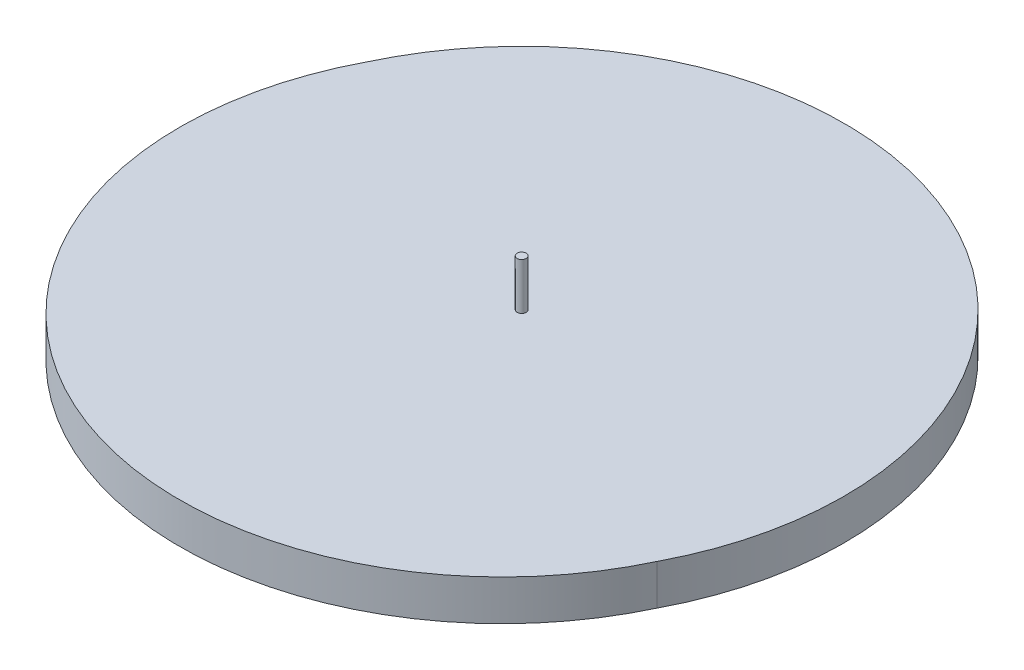
ISO-10303-21;
HEADER;
FILE_DESCRIPTION(('STEP AP214'),'2;1');
FILE_NAME('part.step','',(''),(''),'','','');
FILE_SCHEMA(('AUTOMOTIVE_DESIGN { 1 0 10303 214 1 1 1 1 }'));
ENDSEC;
DATA;
#1=APPLICATION_CONTEXT('core data for automotive mechanical design processes');
#2=APPLICATION_PROTOCOL_DEFINITION('international standard','automotive_design',2000,#1);
#3=PRODUCT_CONTEXT('',#1,'mechanical');
#4=PRODUCT('Part','Part','',(#3));
#5=PRODUCT_RELATED_PRODUCT_CATEGORY('part','',(#4));
#6=PRODUCT_DEFINITION_FORMATION('','',#4);
#7=PRODUCT_DEFINITION_CONTEXT('part definition',#1,'design');
#8=PRODUCT_DEFINITION('design','',#6,#7);
#9=PRODUCT_DEFINITION_SHAPE('','',#8);
#10=(LENGTH_UNIT() NAMED_UNIT(*) SI_UNIT(.MILLI.,.METRE.));
#11=(NAMED_UNIT(*) PLANE_ANGLE_UNIT() SI_UNIT($,.RADIAN.));
#12=(NAMED_UNIT(*) SI_UNIT($,.STERADIAN.) SOLID_ANGLE_UNIT());
#13=UNCERTAINTY_MEASURE_WITH_UNIT(LENGTH_MEASURE(1.E-05),#10,'distance_accuracy_value','');
#14=(GEOMETRIC_REPRESENTATION_CONTEXT(3) GLOBAL_UNCERTAINTY_ASSIGNED_CONTEXT((#13)) GLOBAL_UNIT_ASSIGNED_CONTEXT((#10,
#11,#12)) REPRESENTATION_CONTEXT('',''));
#15=CARTESIAN_POINT('',(0.,0.,0.));
#16=DIRECTION('',(0.,0.,1.));
#17=DIRECTION('',(1.,0.,0.));
#18=AXIS2_PLACEMENT_3D('',#15,#16,#17);
#19=CARTESIAN_POINT('',(951.903947575167,1.56125112837913E-12,9.96365764271792));
#20=DIRECTION('',(0.,-1.,0.));
#21=DIRECTION('',(0.,0.,-1.));
#22=AXIS2_PLACEMENT_3D('',#19,#20,#21);
#23=CYLINDRICAL_SURFACE('',#22,334.999999999987);
#24=CARTESIAN_POINT('',(951.903947575167,-20.9999999999984,9.96365764271792));
#25=DIRECTION('',(0.,-1.,0.));
#26=DIRECTION('',(0.,0.,-1.));
#27=AXIS2_PLACEMENT_3D('',#24,#25,#26);
#28=CIRCLE('',#27,334.999999999987);
#29=CARTESIAN_POINT('',(1248.44777688776,-20.999999999999,165.805748544415));
#30=VERTEX_POINT('',#29);
#31=CARTESIAN_POINT('',(648.681133677734,-20.9999999999985,-132.447455449323));
#32=VERTEX_POINT('',#31);
#33=EDGE_CURVE('E73',#30,#32,#28,.F.);
#34=ORIENTED_EDGE('',*,*,#33,.T.);
#35=DIRECTION('',(0.,-1.,0.));
#36=VECTOR('',#35,1.);
#37=CARTESIAN_POINT('',(648.681133677734,1.52308721190764E-12,-132.447455449323));
#38=LINE('',#37,#36);
#39=CARTESIAN_POINT('',(648.681133677734,21.0000000000015,-132.447455449323));
#40=VERTEX_POINT('',#39);
#41=EDGE_CURVE('E88',#32,#40,#38,.F.);
#42=ORIENTED_EDGE('',*,*,#41,.T.);
#43=CARTESIAN_POINT('',(951.903947575167,21.0000000000016,9.96365764271792));
#44=DIRECTION('',(0.,-1.,0.));
#45=DIRECTION('',(0.,0.,-1.));
#46=AXIS2_PLACEMENT_3D('',#43,#44,#45);
#47=CIRCLE('',#46,334.999999999987);
#48=CARTESIAN_POINT('',(1248.44777688776,21.0000000000015,165.805748544415));
#49=VERTEX_POINT('',#48);
#50=EDGE_CURVE('E101',#40,#49,#47,.T.);
#51=ORIENTED_EDGE('',*,*,#50,.T.);
#52=DIRECTION('',(0.,-1.,0.));
#53=VECTOR('',#52,1.);
#54=CARTESIAN_POINT('',(1248.44777688776,1.52308721190764E-12,165.805748544415));
#55=LINE('',#54,#53);
#56=EDGE_CURVE('E97',#49,#30,#55,.T.);
#57=ORIENTED_EDGE('',*,*,#56,.T.);
#58=EDGE_LOOP('',(#34,#42,#51,#57));
#59=FACE_BOUND('',#58,.T.);
#60=ADVANCED_FACE('F61',(#59),#23,.T.);
#61=CARTESIAN_POINT('',(951.903947575167,-20.9999999999984,9.96365764271792));
#62=DIRECTION('',(0.,-1.,0.));
#63=DIRECTION('',(0.,0.,-1.));
#64=AXIS2_PLACEMENT_3D('',#61,#62,#63);
#65=PLANE('',#64);
#66=ORIENTED_EDGE('',*,*,#33,.F.);
#67=CARTESIAN_POINT('',(945.224962990449,-20.9999999999985,23.3946354521365));
#68=DIRECTION('',(0.,1.,0.));
#69=DIRECTION('',(0.,0.,1.));
#70=AXIS2_PLACEMENT_3D('',#67,#68,#69);
#71=CIRCLE('',#70,334.999999999981);
#72=EDGE_CURVE('E78',#32,#30,#71,.T.);
#73=ORIENTED_EDGE('',*,*,#72,.F.);
#74=EDGE_LOOP('',(#66,#73));
#75=FACE_BOUND('',#74,.T.);
#76=CARTESIAN_POINT('',(951.903947575167,-20.9999999999984,9.96365764271792));
#77=DIRECTION('',(0.,-1.,0.));
#78=DIRECTION('',(0.,0.,-1.));
#79=AXIS2_PLACEMENT_3D('',#76,#77,#78);
#80=CIRCLE('',#79,4.74999999998679);
#81=CARTESIAN_POINT('',(951.903947575167,-20.9999999999982,5.21365764273113));
#82=VERTEX_POINT('',#81);
#83=EDGE_CURVE('E104',#82,#82,#80,.F.);
#84=ORIENTED_EDGE('',*,*,#83,.T.);
#85=EDGE_LOOP('',(#84));
#86=FACE_BOUND('',#85,.T.);
#87=ADVANCED_FACE('F69',(#75,#86),#65,.T.);
#88=CARTESIAN_POINT('',(951.903947575167,21.0000000000016,9.96365764271792));
#89=DIRECTION('',(0.,-1.,0.));
#90=DIRECTION('',(0.,0.,-1.));
#91=AXIS2_PLACEMENT_3D('',#88,#89,#90);
#92=PLANE('',#91);
#93=ORIENTED_EDGE('',*,*,#50,.F.);
#94=CARTESIAN_POINT('',(945.224962990449,21.0000000000015,23.3946354521365));
#95=DIRECTION('',(0.,1.,0.));
#96=DIRECTION('',(0.,0.,1.));
#97=AXIS2_PLACEMENT_3D('',#94,#95,#96);
#98=CIRCLE('',#97,334.999999999981);
#99=EDGE_CURVE('E81',#40,#49,#98,.T.);
#100=ORIENTED_EDGE('',*,*,#99,.T.);
#101=EDGE_LOOP('',(#93,#100));
#102=FACE_BOUND('',#101,.T.);
#103=CARTESIAN_POINT('',(951.903947575167,21.0000000000016,9.96365764271792));
#104=DIRECTION('',(0.,-1.,0.));
#105=DIRECTION('',(0.,0.,-1.));
#106=AXIS2_PLACEMENT_3D('',#103,#104,#105);
#107=CIRCLE('',#106,4.74999999998679);
#108=CARTESIAN_POINT('',(951.903947575167,21.0000000000018,5.21365764273113));
#109=VERTEX_POINT('',#108);
#110=EDGE_CURVE('E12',#109,#109,#107,.F.);
#111=ORIENTED_EDGE('',*,*,#110,.F.);
#112=EDGE_LOOP('',(#111));
#113=FACE_BOUND('',#112,.T.);
#114=ADVANCED_FACE('F116',(#102,#113),#92,.F.);
#115=CARTESIAN_POINT('',(951.903947575167,69.5,9.96365764271792));
#116=DIRECTION('',(0.,1.,0.));
#117=DIRECTION('',(0.,0.,1.));
#118=AXIS2_PLACEMENT_3D('',#115,#116,#117);
#119=PLANE('',#118);
#120=CARTESIAN_POINT('',(951.903947575167,69.5,9.96365764271792));
#121=DIRECTION('',(0.,1.,0.));
#122=DIRECTION('',(0.,0.,1.));
#123=AXIS2_PLACEMENT_3D('',#120,#121,#122);
#124=CIRCLE('',#123,4.74999999998679);
#125=CARTESIAN_POINT('',(951.903947575167,69.5,14.7136576427047));
#126=VERTEX_POINT('',#125);
#127=EDGE_CURVE('E107',#126,#126,#124,.T.);
#128=ORIENTED_EDGE('',*,*,#127,.T.);
#129=EDGE_LOOP('',(#128));
#130=FACE_BOUND('',#129,.T.);
#131=ADVANCED_FACE('F118',(#130),#119,.T.);
#132=CARTESIAN_POINT('',(951.903947575167,69.5,9.96365764271792));
#133=DIRECTION('',(0.,-1.,0.));
#134=DIRECTION('',(0.,0.,-1.));
#135=AXIS2_PLACEMENT_3D('',#132,#133,#134);
#136=CYLINDRICAL_SURFACE('',#135,4.74999999998679);
#137=ORIENTED_EDGE('',*,*,#127,.F.);
#138=EDGE_LOOP('',(#137));
#139=FACE_BOUND('',#138,.T.);
#140=ORIENTED_EDGE('',*,*,#110,.T.);
#141=EDGE_LOOP('',(#140));
#142=FACE_BOUND('',#141,.T.);
#143=ADVANCED_FACE('F124',(#139,#142),#136,.T.);
#144=ORIENTED_EDGE('',*,*,#83,.F.);
#145=EDGE_LOOP('',(#144));
#146=FACE_BOUND('',#145,.T.);
#147=CARTESIAN_POINT('',(951.903947575167,-69.5,9.96365764271792));
#148=DIRECTION('',(0.,1.,0.));
#149=DIRECTION('',(0.,0.,1.));
#150=AXIS2_PLACEMENT_3D('',#147,#148,#149);
#151=CIRCLE('',#150,4.74999999998679);
#152=CARTESIAN_POINT('',(951.903947575167,-69.5,14.7136576427047));
#153=VERTEX_POINT('',#152);
#154=EDGE_CURVE('E98',#153,#153,#151,.T.);
#155=ORIENTED_EDGE('',*,*,#154,.T.);
#156=EDGE_LOOP('',(#155));
#157=FACE_BOUND('',#156,.T.);
#158=ADVANCED_FACE('F123',(#146,#157),#136,.T.);
#159=CARTESIAN_POINT('',(951.903947575167,-69.5,9.96365764271792));
#160=DIRECTION('',(0.,1.,0.));
#161=DIRECTION('',(0.,0.,1.));
#162=AXIS2_PLACEMENT_3D('',#159,#160,#161);
#163=PLANE('',#162);
#164=ORIENTED_EDGE('',*,*,#154,.F.);
#165=EDGE_LOOP('',(#164));
#166=FACE_BOUND('',#165,.T.);
#167=ADVANCED_FACE('F134',(#166),#163,.F.);
#168=CARTESIAN_POINT('',(945.224962990449,21.0000000000015,23.3946354521365));
#169=DIRECTION('',(0.,-1.,0.));
#170=DIRECTION('',(0.,0.,-1.));
#171=AXIS2_PLACEMENT_3D('',#168,#169,#170);
#172=CYLINDRICAL_SURFACE('',#171,334.999999999981);
#173=ORIENTED_EDGE('',*,*,#41,.F.);
#174=ORIENTED_EDGE('',*,*,#72,.T.);
#175=ORIENTED_EDGE('',*,*,#56,.F.);
#176=ORIENTED_EDGE('',*,*,#99,.F.);
#177=EDGE_LOOP('',(#173,#174,#175,#176));
#178=FACE_BOUND('',#177,.T.);
#179=ADVANCED_FACE('F92',(#178),#172,.T.);
#180=CLOSED_SHELL('',(#60,#87,#114,#131,#143,#158,#167,#179));
#181=MANIFOLD_SOLID_BREP('B2',#180);
#182=ADVANCED_BREP_SHAPE_REPRESENTATION('',(#18,#181),#14);
#183=SHAPE_DEFINITION_REPRESENTATION(#9,#182);
ENDSEC;
END-ISO-10303-21;
